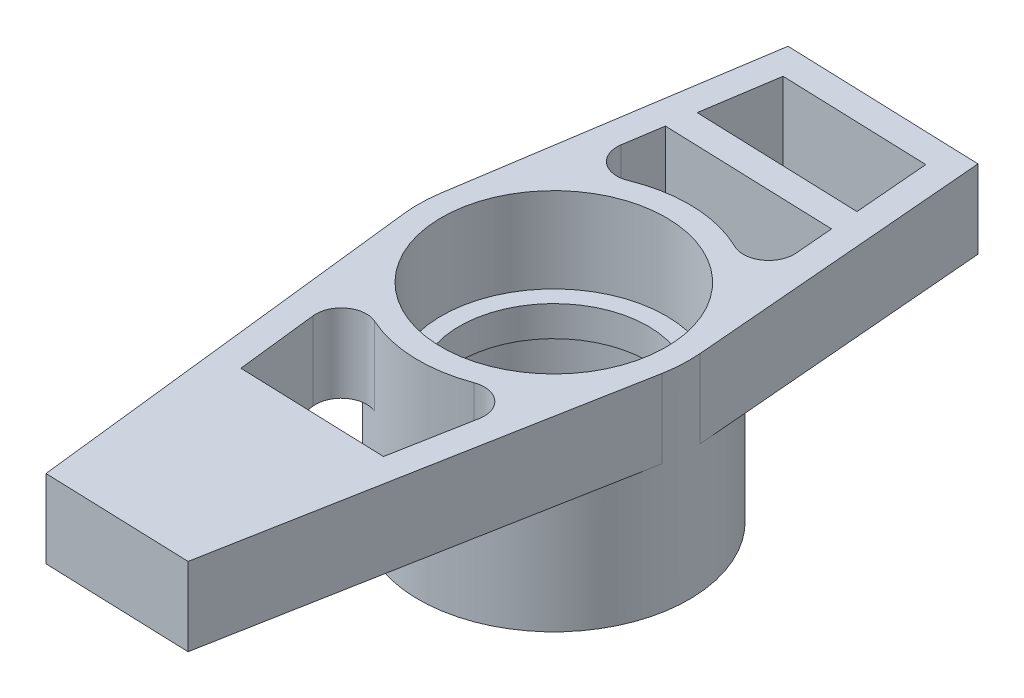
ISO-10303-21;
HEADER;
FILE_DESCRIPTION(('STEP AP214'),'2;1');
FILE_NAME('part.step','',(''),(''),'','','');
FILE_SCHEMA(('AUTOMOTIVE_DESIGN { 1 0 10303 214 1 1 1 1 }'));
ENDSEC;
DATA;
#1=APPLICATION_CONTEXT('core data for automotive mechanical design processes');
#2=APPLICATION_PROTOCOL_DEFINITION('international standard','automotive_design',2000,#1);
#3=PRODUCT_CONTEXT('',#1,'mechanical');
#4=PRODUCT('Part','Part','',(#3));
#5=PRODUCT_RELATED_PRODUCT_CATEGORY('part','',(#4));
#6=PRODUCT_DEFINITION_FORMATION('','',#4);
#7=PRODUCT_DEFINITION_CONTEXT('part definition',#1,'design');
#8=PRODUCT_DEFINITION('design','',#6,#7);
#9=PRODUCT_DEFINITION_SHAPE('','',#8);
#10=(LENGTH_UNIT() NAMED_UNIT(*) SI_UNIT(.MILLI.,.METRE.));
#11=(NAMED_UNIT(*) PLANE_ANGLE_UNIT() SI_UNIT($,.RADIAN.));
#12=(NAMED_UNIT(*) SI_UNIT($,.STERADIAN.) SOLID_ANGLE_UNIT());
#13=UNCERTAINTY_MEASURE_WITH_UNIT(LENGTH_MEASURE(1.E-05),#10,'distance_accuracy_value','');
#14=(GEOMETRIC_REPRESENTATION_CONTEXT(3) GLOBAL_UNCERTAINTY_ASSIGNED_CONTEXT((#13)) GLOBAL_UNIT_ASSIGNED_CONTEXT((#10,
#11,#12)) REPRESENTATION_CONTEXT('',''));
#15=CARTESIAN_POINT('',(0.,0.,0.));
#16=DIRECTION('',(0.,0.,1.));
#17=DIRECTION('',(1.,0.,0.));
#18=AXIS2_PLACEMENT_3D('',#15,#16,#17);
#19=CARTESIAN_POINT('',(0.,-67.691,0.));
#20=DIRECTION('',(0.,1.,0.));
#21=DIRECTION('',(0.,0.,1.));
#22=AXIS2_PLACEMENT_3D('',#19,#20,#21);
#23=CYLINDRICAL_SURFACE('',#22,37.34054);
#24=CARTESIAN_POINT('',(0.,-67.691,0.));
#25=DIRECTION('',(0.,-1.,0.));
#26=DIRECTION('',(0.,0.,-1.));
#27=AXIS2_PLACEMENT_3D('',#24,#25,#26);
#28=CIRCLE('',#27,37.34054);
#29=CARTESIAN_POINT('',(0.,-67.691,-37.34054));
#30=VERTEX_POINT('',#29);
#31=EDGE_CURVE('E12',#30,#30,#28,.T.);
#32=ORIENTED_EDGE('',*,*,#31,.F.);
#33=EDGE_LOOP('',(#32));
#34=FACE_BOUND('',#33,.T.);
#35=DIRECTION('',(0.,1.,0.));
#36=VECTOR('',#35,1.);
#37=CARTESIAN_POINT('',(36.7141403566369,-32.131,6.81086083874628));
#38=LINE('',#37,#36);
#39=CARTESIAN_POINT('',(36.7141403566369,-32.131,6.81086083874629));
#40=VERTEX_POINT('',#39);
#41=CARTESIAN_POINT('',(36.7141403566369,-10.541,6.81086083874628));
#42=VERTEX_POINT('',#41);
#43=EDGE_CURVE('E70',#40,#42,#38,.T.);
#44=ORIENTED_EDGE('',*,*,#43,.F.);
#45=CARTESIAN_POINT('',(0.,-32.131,0.));
#46=DIRECTION('',(0.,-1.,0.));
#47=DIRECTION('',(0.,0.,-1.));
#48=AXIS2_PLACEMENT_3D('',#45,#46,#47);
#49=CIRCLE('',#48,37.34054);
#50=CARTESIAN_POINT('',(12.9848032393378,-32.131,35.0101529892013));
#51=VERTEX_POINT('',#50);
#52=EDGE_CURVE('E65',#40,#51,#49,.T.);
#53=ORIENTED_EDGE('',*,*,#52,.T.);
#54=DIRECTION('',(0.,1.,0.));
#55=VECTOR('',#54,1.);
#56=CARTESIAN_POINT('',(12.9848032393378,-32.131,35.0101529892013));
#57=LINE('',#56,#55);
#58=CARTESIAN_POINT('',(12.9848032393378,-10.541,35.0101529892013));
#59=VERTEX_POINT('',#58);
#60=EDGE_CURVE('E271',#51,#59,#57,.T.);
#61=ORIENTED_EDGE('',*,*,#60,.T.);
#62=CARTESIAN_POINT('',(0.,-10.541,0.));
#63=DIRECTION('',(0.,-1.,0.));
#64=DIRECTION('',(0.,0.,-1.));
#65=AXIS2_PLACEMENT_3D('',#62,#63,#64);
#66=CIRCLE('',#65,37.34054);
#67=CARTESIAN_POINT('',(-15.3953577290297,-10.541,34.0190959298863));
#68=VERTEX_POINT('',#67);
#69=EDGE_CURVE('E752',#59,#68,#66,.T.);
#70=ORIENTED_EDGE('',*,*,#69,.T.);
#71=DIRECTION('',(0.,1.,0.));
#72=VECTOR('',#71,1.);
#73=CARTESIAN_POINT('',(-15.3953577290297,-32.131,34.0190959298863));
#74=LINE('',#73,#72);
#75=CARTESIAN_POINT('',(-15.3953577290297,-32.131,34.0190959298863));
#76=VERTEX_POINT('',#75);
#77=EDGE_CURVE('E282',#76,#68,#74,.T.);
#78=ORIENTED_EDGE('',*,*,#77,.F.);
#79=CARTESIAN_POINT('',(0.,-32.131,0.));
#80=DIRECTION('',(0.,-1.,0.));
#81=DIRECTION('',(0.,0.,-1.));
#82=AXIS2_PLACEMENT_3D('',#79,#80,#81);
#83=CIRCLE('',#82,37.34054);
#84=CARTESIAN_POINT('',(-37.0998081912473,-32.131,4.23322095622985));
#85=VERTEX_POINT('',#84);
#86=EDGE_CURVE('E234',#76,#85,#83,.T.);
#87=ORIENTED_EDGE('',*,*,#86,.T.);
#88=DIRECTION('',(0.,1.,0.));
#89=VECTOR('',#88,1.);
#90=CARTESIAN_POINT('',(-37.0998081912473,-32.131,4.23322095622984));
#91=LINE('',#90,#89);
#92=CARTESIAN_POINT('',(-37.0998081912473,-10.541,4.23322095622984));
#93=VERTEX_POINT('',#92);
#94=EDGE_CURVE('E285',#85,#93,#91,.T.);
#95=ORIENTED_EDGE('',*,*,#94,.T.);
#96=CARTESIAN_POINT('',(-36.9041812246731,-10.541,-5.69186574227512));
#97=VERTEX_POINT('',#96);
#98=EDGE_CURVE('E764',#93,#97,#66,.T.);
#99=ORIENTED_EDGE('',*,*,#98,.T.);
#100=DIRECTION('',(0.,1.,0.));
#101=VECTOR('',#100,1.);
#102=CARTESIAN_POINT('',(-36.9041812246731,-32.131,-5.69186574227513));
#103=LINE('',#102,#101);
#104=CARTESIAN_POINT('',(-36.9041812246731,-32.131,-5.69186574227513));
#105=VERTEX_POINT('',#104);
#106=EDGE_CURVE('E366',#105,#97,#103,.T.);
#107=ORIENTED_EDGE('',*,*,#106,.F.);
#108=CARTESIAN_POINT('',(0.,-32.131,0.));
#109=DIRECTION('',(0.,-1.,0.));
#110=DIRECTION('',(0.,0.,-1.));
#111=AXIS2_PLACEMENT_3D('',#108,#109,#110);
#112=CIRCLE('',#111,37.34054);
#113=CARTESIAN_POINT('',(-14.0428642299643,-32.131,-34.5993336888211));
#114=VERTEX_POINT('',#113);
#115=EDGE_CURVE('E320',#105,#114,#112,.T.);
#116=ORIENTED_EDGE('',*,*,#115,.T.);
#117=DIRECTION('',(0.,1.,0.));
#118=VECTOR('',#117,1.);
#119=CARTESIAN_POINT('',(-14.0428642299643,-32.131,-34.5993336888211));
#120=LINE('',#119,#118);
#121=CARTESIAN_POINT('',(-14.0428642299643,-10.541,-34.5993336888211));
#122=VERTEX_POINT('',#121);
#123=EDGE_CURVE('E369',#114,#122,#120,.T.);
#124=ORIENTED_EDGE('',*,*,#123,.T.);
#125=CARTESIAN_POINT('',(16.4221840305204,-10.541,-33.5354707609618));
#126=VERTEX_POINT('',#125);
#127=EDGE_CURVE('E53',#122,#126,#66,.T.);
#128=ORIENTED_EDGE('',*,*,#127,.T.);
#129=DIRECTION('',(0.,1.,0.));
#130=VECTOR('',#129,1.);
#131=CARTESIAN_POINT('',(16.4221840305204,-32.131,-33.5354707609618));
#132=LINE('',#131,#130);
#133=CARTESIAN_POINT('',(16.4221840305204,-32.131,-33.5354707609617));
#134=VERTEX_POINT('',#133);
#135=EDGE_CURVE('E380',#134,#126,#132,.T.);
#136=ORIENTED_EDGE('',*,*,#135,.F.);
#137=CARTESIAN_POINT('',(0.,-32.131,0.));
#138=DIRECTION('',(0.,-1.,0.));
#139=DIRECTION('',(0.,0.,-1.));
#140=AXIS2_PLACEMENT_3D('',#137,#138,#139);
#141=CIRCLE('',#140,37.34054);
#142=CARTESIAN_POINT('',(37.2113289772135,-32.131,-3.10369509475171));
#143=VERTEX_POINT('',#142);
#144=EDGE_CURVE('E303',#134,#143,#141,.T.);
#145=ORIENTED_EDGE('',*,*,#144,.T.);
#146=DIRECTION('',(0.,1.,0.));
#147=VECTOR('',#146,1.);
#148=CARTESIAN_POINT('',(37.2113289772135,-32.131,-3.10369509475171));
#149=LINE('',#148,#147);
#150=CARTESIAN_POINT('',(37.2113289772135,-10.541,-3.10369509475171));
#151=VERTEX_POINT('',#150);
#152=EDGE_CURVE('E383',#143,#151,#149,.T.);
#153=ORIENTED_EDGE('',*,*,#152,.T.);
#154=EDGE_CURVE('E58',#151,#42,#66,.T.);
#155=ORIENTED_EDGE('',*,*,#154,.T.);
#156=EDGE_LOOP('',(#44,#53,#61,#70,#78,#87,#95,#99,#107,#116,#124,#128,#136,#145,#153,#155));
#157=FACE_BOUND('',#156,.T.);
#158=ADVANCED_FACE('F49',(#34,#157),#23,.T.);
#159=CARTESIAN_POINT('',(0.,-67.691,0.));
#160=DIRECTION('',(0.,1.,0.));
#161=DIRECTION('',(0.,0.,1.));
#162=AXIS2_PLACEMENT_3D('',#159,#160,#161);
#163=CYLINDRICAL_SURFACE('',#162,26.03754);
#164=CARTESIAN_POINT('',(0.,-34.036,0.));
#165=DIRECTION('',(0.,-1.,0.));
#166=DIRECTION('',(0.,0.,-1.));
#167=AXIS2_PLACEMENT_3D('',#164,#165,#166);
#168=CIRCLE('',#167,26.03754);
#169=CARTESIAN_POINT('',(0.,-34.036,-26.03754));
#170=VERTEX_POINT('',#169);
#171=EDGE_CURVE('E404',#170,#170,#168,.T.);
#172=ORIENTED_EDGE('',*,*,#171,.F.);
#173=EDGE_LOOP('',(#172));
#174=FACE_BOUND('',#173,.T.);
#175=CARTESIAN_POINT('',(0.,-42.418,0.));
#176=DIRECTION('',(0.,-1.,0.));
#177=DIRECTION('',(0.,0.,-1.));
#178=AXIS2_PLACEMENT_3D('',#175,#176,#177);
#179=CIRCLE('',#178,26.03754);
#180=CARTESIAN_POINT('',(0.,-42.418,-26.03754));
#181=VERTEX_POINT('',#180);
#182=EDGE_CURVE('E386',#181,#181,#179,.T.);
#183=ORIENTED_EDGE('',*,*,#182,.T.);
#184=EDGE_LOOP('',(#183));
#185=FACE_BOUND('',#184,.T.);
#186=ADVANCED_FACE('F51',(#174,#185),#163,.F.);
#187=CARTESIAN_POINT('',(0.,-67.691,0.));
#188=DIRECTION('',(0.,-1.,0.));
#189=DIRECTION('',(0.,0.,-1.));
#190=AXIS2_PLACEMENT_3D('',#187,#188,#189);
#191=PLANE('',#190);
#192=CARTESIAN_POINT('',(0.,-67.691,0.));
#193=DIRECTION('',(0.,-1.,0.));
#194=DIRECTION('',(0.,0.,-1.));
#195=AXIS2_PLACEMENT_3D('',#192,#193,#194);
#196=CIRCLE('',#195,30.99054);
#197=CARTESIAN_POINT('',(0.,-67.691,-30.99054));
#198=VERTEX_POINT('',#197);
#199=EDGE_CURVE('E397',#198,#198,#196,.T.);
#200=ORIENTED_EDGE('',*,*,#199,.F.);
#201=EDGE_LOOP('',(#200));
#202=FACE_BOUND('',#201,.T.);
#203=ORIENTED_EDGE('',*,*,#31,.T.);
#204=EDGE_LOOP('',(#203));
#205=FACE_BOUND('',#204,.T.);
#206=ADVANCED_FACE('F428',(#202,#205),#191,.T.);
#207=CARTESIAN_POINT('',(0.,-10.541,0.));
#208=DIRECTION('',(0.,-1.,0.));
#209=DIRECTION('',(0.,0.,-1.));
#210=AXIS2_PLACEMENT_3D('',#207,#208,#209);
#211=PLANE('',#210);
#212=ORIENTED_EDGE('',*,*,#98,.F.);
#213=DIRECTION('',(0.113367962976161,0.,0.993553071038803));
#214=VECTOR('',#213,1.);
#215=CARTESIAN_POINT('',(-37.0998081912473,-10.541,4.23322095622985));
#216=LINE('',#215,#214);
#217=CARTESIAN_POINT('',(-24.3746710757541,-10.541,115.755900984861));
#218=VERTEX_POINT('',#217);
#219=EDGE_CURVE('E254',#93,#218,#216,.T.);
#220=ORIENTED_EDGE('',*,*,#219,.T.);
#221=DIRECTION('',(0.999390827019096,0.,0.0348994967025018));
#222=VECTOR('',#221,1.);
#223=CARTESIAN_POINT('',(-4.06704947072605,-10.541,116.465058757856));
#224=LINE('',#223,#222);
#225=CARTESIAN_POINT('',(16.240572134302,-10.541,117.174216530851));
#226=VERTEX_POINT('',#225);
#227=EDGE_CURVE('E252',#218,#226,#224,.T.);
#228=ORIENTED_EDGE('',*,*,#227,.T.);
#229=DIRECTION('',(-0.182398563029519,0.,0.983224676360783));
#230=VECTOR('',#229,1.);
#231=CARTESIAN_POINT('',(36.7141403566369,-10.541,6.81086083874629));
#232=LINE('',#231,#230);
#233=EDGE_CURVE('E224',#42,#226,#232,.T.);
#234=ORIENTED_EDGE('',*,*,#233,.F.);
#235=ORIENTED_EDGE('',*,*,#154,.F.);
#236=DIRECTION('',(0.0831186451709512,0.,0.996539658430584));
#237=VECTOR('',#236,1.);
#238=CARTESIAN_POINT('',(37.2113289772135,-10.541,-3.10369509475171));
#239=LINE('',#238,#237);
#240=CARTESIAN_POINT('',(30.2274757344905,-10.541,-86.8356509118666));
#241=VERTEX_POINT('',#240);
#242=EDGE_CURVE('E338',#241,#151,#239,.T.);
#243=ORIENTED_EDGE('',*,*,#242,.F.);
#244=DIRECTION('',(-0.999390827019096,0.,-0.0348994967025017));
#245=VECTOR('',#244,1.);
#246=CARTESIAN_POINT('',(3.06549070727469,-10.541,-87.7841683299404));
#247=LINE('',#246,#245);
#248=CARTESIAN_POINT('',(-24.0964943199411,-10.541,-88.7326857480141));
#249=VERTEX_POINT('',#248);
#250=EDGE_CURVE('E293',#241,#249,#247,.T.);
#251=ORIENTED_EDGE('',*,*,#250,.T.);
#252=DIRECTION('',(0.152431264847137,0.,-0.988314074319041));
#253=VECTOR('',#252,1.);
#254=CARTESIAN_POINT('',(-36.9041812246731,-10.541,-5.69186574227512));
#255=LINE('',#254,#253);
#256=EDGE_CURVE('E356',#97,#249,#255,.T.);
#257=ORIENTED_EDGE('',*,*,#256,.F.);
#258=EDGE_LOOP('',(#212,#220,#228,#234,#235,#243,#251,#257));
#259=FACE_BOUND('',#258,.T.);
#260=CARTESIAN_POINT('',(-18.2752457471803,-10.541,40.3827796117574));
#261=DIRECTION('',(0.,-1.,0.));
#262=DIRECTION('',(0.,0.,-1.));
#263=AXIS2_PLACEMENT_3D('',#260,#261,#262);
#264=CIRCLE('',#263,6.985);
#265=CARTESIAN_POINT('',(-25.2152139483864,-10.541,41.1746548331459));
#266=VERTEX_POINT('',#265);
#267=EDGE_CURVE('E257',#266,#68,#264,.T.);
#268=ORIENTED_EDGE('',*,*,#267,.T.);
#269=ORIENTED_EDGE('',*,*,#69,.F.);
#270=CARTESIAN_POINT('',(15.4137678613484,-10.541,41.5592258903852));
#271=DIRECTION('',(0.,-1.,0.));
#272=DIRECTION('',(0.,0.,-1.));
#273=AXIS2_PLACEMENT_3D('',#270,#271,#272);
#274=CIRCLE('',#273,6.98499999999999);
#275=CARTESIAN_POINT('',(22.2815922257285,-10.541,42.8332798531464));
#276=VERTEX_POINT('',#275);
#277=EDGE_CURVE('E218',#276,#59,#274,.F.);
#278=ORIENTED_EDGE('',*,*,#277,.F.);
#279=DIRECTION('',(-0.182398563029519,0.,0.983224676360783));
#280=VECTOR('',#279,1.);
#281=CARTESIAN_POINT('',(29.2219683227677,-10.541,5.42098378846133));
#282=LINE('',#281,#280);
#283=CARTESIAN_POINT('',(18.1436576295751,-10.541,65.138934769115));
#284=VERTEX_POINT('',#283);
#285=EDGE_CURVE('E265',#276,#284,#282,.T.);
#286=ORIENTED_EDGE('',*,*,#285,.T.);
#287=DIRECTION('',(0.999390827019096,0.,0.0348994967025018));
#288=VECTOR('',#287,1.);
#289=CARTESIAN_POINT('',(-2.24983267742678,-10.541,64.426778394972));
#290=LINE('',#289,#288);
#291=CARTESIAN_POINT('',(-22.6433229844287,-10.541,63.7146220208289));
#292=VERTEX_POINT('',#291);
#293=EDGE_CURVE('E262',#292,#284,#290,.T.);
#294=ORIENTED_EDGE('',*,*,#293,.F.);
#295=DIRECTION('',(0.113367962976161,0.,0.993553071038803));
#296=VECTOR('',#295,1.);
#297=CARTESIAN_POINT('',(-29.5289337899316,-10.541,3.36935707835151));
#298=LINE('',#297,#296);
#299=EDGE_CURVE('E260',#266,#292,#298,.T.);
#300=ORIENTED_EDGE('',*,*,#299,.F.);
#301=EDGE_LOOP('',(#268,#269,#278,#286,#294,#300));
#302=FACE_BOUND('',#301,.T.);
#303=CARTESIAN_POINT('',(0.,-10.541,0.));
#304=DIRECTION('',(0.,-1.,0.));
#305=DIRECTION('',(0.,0.,-1.));
#306=AXIS2_PLACEMENT_3D('',#303,#304,#305);
#307=CIRCLE('',#306,30.99054);
#308=CARTESIAN_POINT('',(0.,-10.541,-30.99054));
#309=VERTEX_POINT('',#308);
#310=EDGE_CURVE('E401',#309,#309,#307,.T.);
#311=ORIENTED_EDGE('',*,*,#310,.T.);
#312=EDGE_LOOP('',(#311));
#313=FACE_BOUND('',#312,.T.);
#314=CARTESIAN_POINT('',(19.4941523377057,-10.541,-39.8086865008872));
#315=DIRECTION('',(0.,-1.,0.));
#316=DIRECTION('',(0.,0.,-1.));
#317=AXIS2_PLACEMENT_3D('',#314,#315,#316);
#318=CIRCLE('',#317,6.985);
#319=CARTESIAN_POINT('',(26.4549818518434,-10.541,-40.3892702374063));
#320=VERTEX_POINT('',#319);
#321=EDGE_CURVE('E341',#320,#126,#318,.T.);
#322=ORIENTED_EDGE('',*,*,#321,.T.);
#323=ORIENTED_EDGE('',*,*,#127,.F.);
#324=CARTESIAN_POINT('',(-16.6697519676965,-10.541,-41.0715578670578));
#325=DIRECTION('',(0.,-1.,0.));
#326=DIRECTION('',(0.,0.,-1.));
#327=AXIS2_PLACEMENT_3D('',#324,#325,#326);
#328=CIRCLE('',#327,6.98499999999995);
#329=CARTESIAN_POINT('',(-23.5731257768149,-10.541,-42.1362902520151));
#330=VERTEX_POINT('',#329);
#331=EDGE_CURVE('E353',#330,#122,#328,.F.);
#332=ORIENTED_EDGE('',*,*,#331,.F.);
#333=DIRECTION('',(0.152431264847129,0.,-0.988314074319042));
#334=VECTOR('',#333,1.);
#335=CARTESIAN_POINT('',(-29.3732279783616,-10.541,-4.53033950413963));
#336=LINE('',#335,#334);
#337=CARTESIAN_POINT('',(-21.9368761363964,-10.541,-52.7451935524428));
#338=VERTEX_POINT('',#337);
#339=EDGE_CURVE('E350',#330,#338,#336,.T.);
#340=ORIENTED_EDGE('',*,*,#339,.T.);
#341=DIRECTION('',(0.999390827019096,0.,0.0348994967025017));
#342=VECTOR('',#341,1.);
#343=CARTESIAN_POINT('',(1.81294079072256,-10.541,-51.9158316700596));
#344=LINE('',#343,#342);
#345=CARTESIAN_POINT('',(25.5627577178415,-10.541,-51.0864697876765));
#346=VERTEX_POINT('',#345);
#347=EDGE_CURVE('E347',#338,#346,#344,.T.);
#348=ORIENTED_EDGE('',*,*,#347,.T.);
#349=DIRECTION('',(0.0831186451709451,0.,0.996539658430585));
#350=VECTOR('',#349,1.);
#351=CARTESIAN_POINT('',(29.6176967799722,-10.541,-2.47033101854886));
#352=LINE('',#351,#350);
#353=EDGE_CURVE('E344',#346,#320,#352,.T.);
#354=ORIENTED_EDGE('',*,*,#353,.T.);
#355=EDGE_LOOP('',(#322,#323,#332,#340,#348,#354));
#356=FACE_BOUND('',#355,.T.);
#357=DIRECTION('',(0.999390827019096,0.,0.0348994967025019));
#358=VECTOR('',#357,1.);
#359=CARTESIAN_POINT('',(2.07887495559564,-10.541,-59.5311897719451));
#360=LINE('',#359,#358);
#361=CARTESIAN_POINT('',(-20.7671993500609,-10.541,-60.3289922665643));
#362=VERTEX_POINT('',#361);
#363=CARTESIAN_POINT('',(24.9249492612522,-10.541,-58.7333872773259));
#364=VERTEX_POINT('',#363);
#365=EDGE_CURVE('E228',#362,#364,#360,.T.);
#366=ORIENTED_EDGE('',*,*,#365,.F.);
#367=DIRECTION('',(0.152431264847139,0.,-0.98831407431904));
#368=VECTOR('',#367,1.);
#369=CARTESIAN_POINT('',(-29.3732279783621,-10.541,-4.53033950414));
#370=LINE('',#369,#368);
#371=CARTESIAN_POINT('',(-17.5973752590917,-10.541,-80.8810867818338));
#372=VERTEX_POINT('',#371);
#373=EDGE_CURVE('E335',#362,#372,#370,.T.);
#374=ORIENTED_EDGE('',*,*,#373,.T.);
#375=DIRECTION('',(-0.999390827019096,0.,-0.0348994967025017));
#376=VECTOR('',#375,1.);
#377=CARTESIAN_POINT('',(2.79955654240163,-10.541,-80.1688102280549));
#378=LINE('',#377,#376);
#379=CARTESIAN_POINT('',(23.1964883438949,-10.541,-79.456533674276));
#380=VERTEX_POINT('',#379);
#381=EDGE_CURVE('E332',#380,#372,#378,.T.);
#382=ORIENTED_EDGE('',*,*,#381,.F.);
#383=DIRECTION('',(-0.0831186451709525,0.,-0.996539658430584));
#384=VECTOR('',#383,1.);
#385=CARTESIAN_POINT('',(29.6176967799726,-10.541,-2.4703310185491));
#386=LINE('',#385,#384);
#387=EDGE_CURVE('E330',#364,#380,#386,.T.);
#388=ORIENTED_EDGE('',*,*,#387,.F.);
#389=EDGE_LOOP('',(#366,#374,#382,#388));
#390=FACE_BOUND('',#389,.T.);
#391=ADVANCED_FACE('F413',(#259,#302,#313,#356,#390),#211,.F.);
#392=CARTESIAN_POINT('',(0.,-34.036,0.));
#393=DIRECTION('',(0.,1.,0.));
#394=DIRECTION('',(0.,0.,1.));
#395=AXIS2_PLACEMENT_3D('',#392,#393,#394);
#396=CYLINDRICAL_SURFACE('',#395,30.99054);
#397=CARTESIAN_POINT('',(0.,-34.036,0.));
#398=DIRECTION('',(0.,-1.,0.));
#399=DIRECTION('',(0.,0.,-1.));
#400=AXIS2_PLACEMENT_3D('',#397,#398,#399);
#401=CIRCLE('',#400,30.99054);
#402=CARTESIAN_POINT('',(0.,-34.036,-30.99054));
#403=VERTEX_POINT('',#402);
#404=EDGE_CURVE('E407',#403,#403,#401,.T.);
#405=ORIENTED_EDGE('',*,*,#404,.T.);
#406=EDGE_LOOP('',(#405));
#407=FACE_BOUND('',#406,.T.);
#408=ORIENTED_EDGE('',*,*,#310,.F.);
#409=EDGE_LOOP('',(#408));
#410=FACE_BOUND('',#409,.T.);
#411=ADVANCED_FACE('F416',(#407,#410),#396,.F.);
#412=CARTESIAN_POINT('',(0.,-34.036,0.));
#413=DIRECTION('',(0.,-1.,0.));
#414=DIRECTION('',(0.,0.,-1.));
#415=AXIS2_PLACEMENT_3D('',#412,#413,#414);
#416=PLANE('',#415);
#417=ORIENTED_EDGE('',*,*,#171,.T.);
#418=EDGE_LOOP('',(#417));
#419=FACE_BOUND('',#418,.T.);
#420=ORIENTED_EDGE('',*,*,#404,.F.);
#421=EDGE_LOOP('',(#420));
#422=FACE_BOUND('',#421,.T.);
#423=ADVANCED_FACE('F418',(#419,#422),#416,.F.);
#424=CARTESIAN_POINT('',(0.,-42.418,0.));
#425=DIRECTION('',(0.,-1.,0.));
#426=DIRECTION('',(0.,0.,-1.));
#427=AXIS2_PLACEMENT_3D('',#424,#425,#426);
#428=CYLINDRICAL_SURFACE('',#427,30.99054);
#429=CARTESIAN_POINT('',(0.,-42.418,0.));
#430=DIRECTION('',(0.,-1.,0.));
#431=DIRECTION('',(0.,0.,-1.));
#432=AXIS2_PLACEMENT_3D('',#429,#430,#431);
#433=CIRCLE('',#432,30.99054);
#434=CARTESIAN_POINT('',(0.,-42.418,-30.99054));
#435=VERTEX_POINT('',#434);
#436=EDGE_CURVE('E398',#435,#435,#433,.T.);
#437=ORIENTED_EDGE('',*,*,#436,.F.);
#438=EDGE_LOOP('',(#437));
#439=FACE_BOUND('',#438,.T.);
#440=ORIENTED_EDGE('',*,*,#199,.T.);
#441=EDGE_LOOP('',(#440));
#442=FACE_BOUND('',#441,.T.);
#443=ADVANCED_FACE('F424',(#439,#442),#428,.F.);
#444=CARTESIAN_POINT('',(0.,-42.418,0.));
#445=DIRECTION('',(0.,-1.,0.));
#446=DIRECTION('',(0.,0.,-1.));
#447=AXIS2_PLACEMENT_3D('',#444,#445,#446);
#448=PLANE('',#447);
#449=ORIENTED_EDGE('',*,*,#182,.F.);
#450=EDGE_LOOP('',(#449));
#451=FACE_BOUND('',#450,.T.);
#452=ORIENTED_EDGE('',*,*,#436,.T.);
#453=EDGE_LOOP('',(#452));
#454=FACE_BOUND('',#453,.T.);
#455=ADVANCED_FACE('F448',(#451,#454),#448,.T.);
#456=CARTESIAN_POINT('',(37.2113289772135,-32.131,-3.10369509475171));
#457=DIRECTION('',(-0.996539658430584,0.,0.0831186451709512));
#458=DIRECTION('',(0.0831186451709512,0.,0.996539658430584));
#459=AXIS2_PLACEMENT_3D('',#456,#457,#458);
#460=PLANE('',#459);
#461=ORIENTED_EDGE('',*,*,#242,.T.);
#462=ORIENTED_EDGE('',*,*,#152,.F.);
#463=DIRECTION('',(0.0831186451709512,0.,0.996539658430584));
#464=VECTOR('',#463,1.);
#465=CARTESIAN_POINT('',(37.2113289772135,-32.131,-3.10369509475171));
#466=LINE('',#465,#464);
#467=CARTESIAN_POINT('',(30.2274757344905,-32.131,-86.8356509118666));
#468=VERTEX_POINT('',#467);
#469=EDGE_CURVE('E300',#468,#143,#466,.T.);
#470=ORIENTED_EDGE('',*,*,#469,.F.);
#471=DIRECTION('',(0.,1.,0.));
#472=VECTOR('',#471,1.);
#473=CARTESIAN_POINT('',(30.2274757344905,-32.131,-86.8356509118666));
#474=LINE('',#473,#472);
#475=EDGE_CURVE('E361',#468,#241,#474,.T.);
#476=ORIENTED_EDGE('',*,*,#475,.T.);
#477=EDGE_LOOP('',(#461,#462,#470,#476));
#478=FACE_BOUND('',#477,.T.);
#479=ADVANCED_FACE('F454',(#478),#460,.F.);
#480=CARTESIAN_POINT('',(19.4941523377057,-32.131,-39.8086865008872));
#481=DIRECTION('',(0.,1.,0.));
#482=DIRECTION('',(0.,0.,1.));
#483=AXIS2_PLACEMENT_3D('',#480,#481,#482);
#484=CYLINDRICAL_SURFACE('',#483,6.985);
#485=ORIENTED_EDGE('',*,*,#321,.F.);
#486=DIRECTION('',(0.,1.,0.));
#487=VECTOR('',#486,1.);
#488=CARTESIAN_POINT('',(26.4549818518434,-32.131,-40.3892702374063));
#489=LINE('',#488,#487);
#490=CARTESIAN_POINT('',(26.4549818518434,-32.131,-40.3892702374063));
#491=VERTEX_POINT('',#490);
#492=EDGE_CURVE('E378',#491,#320,#489,.T.);
#493=ORIENTED_EDGE('',*,*,#492,.F.);
#494=CARTESIAN_POINT('',(19.4941523377057,-32.131,-39.8086865008872));
#495=DIRECTION('',(0.,-1.,0.));
#496=DIRECTION('',(0.,0.,-1.));
#497=AXIS2_PLACEMENT_3D('',#494,#495,#496);
#498=CIRCLE('',#497,6.985);
#499=EDGE_CURVE('E305',#491,#134,#498,.T.);
#500=ORIENTED_EDGE('',*,*,#499,.T.);
#501=ORIENTED_EDGE('',*,*,#135,.T.);
#502=EDGE_LOOP('',(#485,#493,#500,#501));
#503=FACE_BOUND('',#502,.T.);
#504=ADVANCED_FACE('F479',(#503),#484,.F.);
#505=CARTESIAN_POINT('',(29.6176967799722,-32.131,-2.47033101854886));
#506=DIRECTION('',(-0.996539658430585,0.,0.0831186451709451));
#507=DIRECTION('',(0.0831186451709451,0.,0.996539658430585));
#508=AXIS2_PLACEMENT_3D('',#505,#506,#507);
#509=PLANE('',#508);
#510=ORIENTED_EDGE('',*,*,#353,.F.);
#511=DIRECTION('',(0.,1.,0.));
#512=VECTOR('',#511,1.);
#513=CARTESIAN_POINT('',(25.5627577178415,-32.131,-51.0864697876765));
#514=LINE('',#513,#512);
#515=CARTESIAN_POINT('',(25.5627577178415,-32.131,-51.0864697876765));
#516=VERTEX_POINT('',#515);
#517=EDGE_CURVE('E376',#516,#346,#514,.T.);
#518=ORIENTED_EDGE('',*,*,#517,.F.);
#519=DIRECTION('',(0.0831186451709451,0.,0.996539658430585));
#520=VECTOR('',#519,1.);
#521=CARTESIAN_POINT('',(29.6176967799722,-32.131,-2.47033101854886));
#522=LINE('',#521,#520);
#523=EDGE_CURVE('E308',#516,#491,#522,.T.);
#524=ORIENTED_EDGE('',*,*,#523,.T.);
#525=ORIENTED_EDGE('',*,*,#492,.T.);
#526=EDGE_LOOP('',(#510,#518,#524,#525));
#527=FACE_BOUND('',#526,.T.);
#528=ADVANCED_FACE('F483',(#527),#509,.T.);
#529=CARTESIAN_POINT('',(1.81294079072256,-32.131,-51.9158316700596));
#530=DIRECTION('',(-0.0348994967025017,0.,0.999390827019096));
#531=DIRECTION('',(0.999390827019096,0.,0.0348994967025017));
#532=AXIS2_PLACEMENT_3D('',#529,#530,#531);
#533=PLANE('',#532);
#534=ORIENTED_EDGE('',*,*,#347,.F.);
#535=DIRECTION('',(0.,1.,0.));
#536=VECTOR('',#535,1.);
#537=CARTESIAN_POINT('',(-21.9368761363964,-32.131,-52.7451935524428));
#538=LINE('',#537,#536);
#539=CARTESIAN_POINT('',(-21.9368761363964,-32.131,-52.7451935524428));
#540=VERTEX_POINT('',#539);
#541=EDGE_CURVE('E374',#540,#338,#538,.T.);
#542=ORIENTED_EDGE('',*,*,#541,.F.);
#543=DIRECTION('',(0.999390827019096,0.,0.0348994967025017));
#544=VECTOR('',#543,1.);
#545=CARTESIAN_POINT('',(1.81294079072256,-32.131,-51.9158316700596));
#546=LINE('',#545,#544);
#547=EDGE_CURVE('E311',#540,#516,#546,.T.);
#548=ORIENTED_EDGE('',*,*,#547,.T.);
#549=ORIENTED_EDGE('',*,*,#517,.T.);
#550=EDGE_LOOP('',(#534,#542,#548,#549));
#551=FACE_BOUND('',#550,.T.);
#552=ADVANCED_FACE('F487',(#551),#533,.T.);
#553=CARTESIAN_POINT('',(-29.3732279783616,-32.131,-4.53033950413963));
#554=DIRECTION('',(0.988314074319042,0.,0.152431264847129));
#555=DIRECTION('',(0.152431264847129,0.,-0.988314074319042));
#556=AXIS2_PLACEMENT_3D('',#553,#554,#555);
#557=PLANE('',#556);
#558=ORIENTED_EDGE('',*,*,#339,.F.);
#559=DIRECTION('',(0.,1.,0.));
#560=VECTOR('',#559,1.);
#561=CARTESIAN_POINT('',(-23.5731257768149,-32.131,-42.1362902520151));
#562=LINE('',#561,#560);
#563=CARTESIAN_POINT('',(-23.5731257768149,-32.131,-42.1362902520151));
#564=VERTEX_POINT('',#563);
#565=EDGE_CURVE('E372',#564,#330,#562,.T.);
#566=ORIENTED_EDGE('',*,*,#565,.F.);
#567=DIRECTION('',(0.152431264847129,0.,-0.988314074319042));
#568=VECTOR('',#567,1.);
#569=CARTESIAN_POINT('',(-29.3732279783616,-32.131,-4.53033950413963));
#570=LINE('',#569,#568);
#571=EDGE_CURVE('E314',#564,#540,#570,.T.);
#572=ORIENTED_EDGE('',*,*,#571,.T.);
#573=ORIENTED_EDGE('',*,*,#541,.T.);
#574=EDGE_LOOP('',(#558,#566,#572,#573));
#575=FACE_BOUND('',#574,.T.);
#576=ADVANCED_FACE('F491',(#575),#557,.T.);
#577=CARTESIAN_POINT('',(-16.6697519676965,-32.131,-41.0715578670578));
#578=DIRECTION('',(0.,1.,0.));
#579=DIRECTION('',(0.,0.,1.));
#580=AXIS2_PLACEMENT_3D('',#577,#578,#579);
#581=CYLINDRICAL_SURFACE('',#580,6.98499999999995);
#582=ORIENTED_EDGE('',*,*,#331,.T.);
#583=ORIENTED_EDGE('',*,*,#123,.F.);
#584=CARTESIAN_POINT('',(-16.6697519676965,-32.131,-41.0715578670578));
#585=DIRECTION('',(0.,-1.,0.));
#586=DIRECTION('',(0.,0.,-1.));
#587=AXIS2_PLACEMENT_3D('',#584,#585,#586);
#588=CIRCLE('',#587,6.98499999999995);
#589=EDGE_CURVE('E317',#564,#114,#588,.F.);
#590=ORIENTED_EDGE('',*,*,#589,.F.);
#591=ORIENTED_EDGE('',*,*,#565,.T.);
#592=EDGE_LOOP('',(#582,#583,#590,#591));
#593=FACE_BOUND('',#592,.T.);
#594=ADVANCED_FACE('F495',(#593),#581,.F.);
#595=CARTESIAN_POINT('',(-36.9041812246731,-32.131,-5.69186574227512));
#596=DIRECTION('',(0.988314074319041,0.,0.152431264847137));
#597=DIRECTION('',(0.152431264847137,0.,-0.988314074319041));
#598=AXIS2_PLACEMENT_3D('',#595,#596,#597);
#599=PLANE('',#598);
#600=ORIENTED_EDGE('',*,*,#256,.T.);
#601=DIRECTION('',(0.,1.,0.));
#602=VECTOR('',#601,1.);
#603=CARTESIAN_POINT('',(-24.0964943199411,-32.131,-88.7326857480141));
#604=LINE('',#603,#602);
#605=CARTESIAN_POINT('',(-24.0964943199411,-32.131,-88.7326857480141));
#606=VERTEX_POINT('',#605);
#607=EDGE_CURVE('E363',#606,#249,#604,.T.);
#608=ORIENTED_EDGE('',*,*,#607,.F.);
#609=DIRECTION('',(0.152431264847137,0.,-0.988314074319041));
#610=VECTOR('',#609,1.);
#611=CARTESIAN_POINT('',(-36.9041812246731,-32.131,-5.69186574227512));
#612=LINE('',#611,#610);
#613=EDGE_CURVE('E322',#105,#606,#612,.T.);
#614=ORIENTED_EDGE('',*,*,#613,.F.);
#615=ORIENTED_EDGE('',*,*,#106,.T.);
#616=EDGE_LOOP('',(#600,#608,#614,#615));
#617=FACE_BOUND('',#616,.T.);
#618=ADVANCED_FACE('F463',(#617),#599,.F.);
#619=CARTESIAN_POINT('',(2.07887495559564,-32.131,-59.5311897719451));
#620=DIRECTION('',(-0.0348994967025019,0.,0.999390827019096));
#621=DIRECTION('',(0.999390827019096,0.,0.0348994967025019));
#622=AXIS2_PLACEMENT_3D('',#619,#620,#621);
#623=PLANE('',#622);
#624=ORIENTED_EDGE('',*,*,#365,.T.);
#625=DIRECTION('',(0.,1.,0.));
#626=VECTOR('',#625,1.);
#627=CARTESIAN_POINT('',(24.9249492612522,-32.131,-58.7333872773259));
#628=LINE('',#627,#626);
#629=CARTESIAN_POINT('',(24.9249492612522,-32.131,-58.7333872773259));
#630=VERTEX_POINT('',#629);
#631=EDGE_CURVE('E364',#630,#364,#628,.T.);
#632=ORIENTED_EDGE('',*,*,#631,.F.);
#633=DIRECTION('',(0.999390827019096,0.,0.0348994967025019));
#634=VECTOR('',#633,1.);
#635=CARTESIAN_POINT('',(2.07887495559564,-32.131,-59.5311897719451));
#636=LINE('',#635,#634);
#637=CARTESIAN_POINT('',(-20.7671993500609,-32.131,-60.3289922665643));
#638=VERTEX_POINT('',#637);
#639=EDGE_CURVE('E289',#638,#630,#636,.T.);
#640=ORIENTED_EDGE('',*,*,#639,.F.);
#641=DIRECTION('',(0.,1.,0.));
#642=VECTOR('',#641,1.);
#643=CARTESIAN_POINT('',(-20.7671993500609,-32.131,-60.3289922665643));
#644=LINE('',#643,#642);
#645=EDGE_CURVE('E327',#638,#362,#644,.T.);
#646=ORIENTED_EDGE('',*,*,#645,.T.);
#647=EDGE_LOOP('',(#624,#632,#640,#646));
#648=FACE_BOUND('',#647,.T.);
#649=ADVANCED_FACE('F459',(#648),#623,.F.);
#650=CARTESIAN_POINT('',(29.6176967799726,-32.131,-2.4703310185491));
#651=DIRECTION('',(0.996539658430584,0.,-0.0831186451709525));
#652=DIRECTION('',(-0.0831186451709525,0.,-0.996539658430584));
#653=AXIS2_PLACEMENT_3D('',#650,#651,#652);
#654=PLANE('',#653);
#655=ORIENTED_EDGE('',*,*,#387,.T.);
#656=DIRECTION('',(0.,1.,0.));
#657=VECTOR('',#656,1.);
#658=CARTESIAN_POINT('',(23.1964883438949,-32.131,-79.456533674276));
#659=LINE('',#658,#657);
#660=CARTESIAN_POINT('',(23.1964883438949,-32.131,-79.456533674276));
#661=VERTEX_POINT('',#660);
#662=EDGE_CURVE('E390',#661,#380,#659,.T.);
#663=ORIENTED_EDGE('',*,*,#662,.F.);
#664=DIRECTION('',(-0.0831186451709525,0.,-0.996539658430584));
#665=VECTOR('',#664,1.);
#666=CARTESIAN_POINT('',(29.6176967799726,-32.131,-2.4703310185491));
#667=LINE('',#666,#665);
#668=EDGE_CURVE('E292',#630,#661,#667,.T.);
#669=ORIENTED_EDGE('',*,*,#668,.F.);
#670=ORIENTED_EDGE('',*,*,#631,.T.);
#671=EDGE_LOOP('',(#655,#663,#669,#670));
#672=FACE_BOUND('',#671,.T.);
#673=ADVANCED_FACE('F462',(#672),#654,.F.);
#674=CARTESIAN_POINT('',(2.79955654240163,-32.131,-80.1688102280549));
#675=DIRECTION('',(0.0348994967025017,0.,-0.999390827019096));
#676=DIRECTION('',(-0.999390827019096,0.,-0.0348994967025017));
#677=AXIS2_PLACEMENT_3D('',#674,#675,#676);
#678=PLANE('',#677);
#679=ORIENTED_EDGE('',*,*,#381,.T.);
#680=DIRECTION('',(0.,1.,0.));
#681=VECTOR('',#680,1.);
#682=CARTESIAN_POINT('',(-17.5973752590917,-32.131,-80.8810867818338));
#683=LINE('',#682,#681);
#684=CARTESIAN_POINT('',(-17.5973752590917,-32.131,-80.8810867818338));
#685=VERTEX_POINT('',#684);
#686=EDGE_CURVE('E388',#685,#372,#683,.T.);
#687=ORIENTED_EDGE('',*,*,#686,.F.);
#688=DIRECTION('',(-0.999390827019096,0.,-0.0348994967025017));
#689=VECTOR('',#688,1.);
#690=CARTESIAN_POINT('',(2.79955654240163,-32.131,-80.1688102280549));
#691=LINE('',#690,#689);
#692=EDGE_CURVE('E295',#661,#685,#691,.T.);
#693=ORIENTED_EDGE('',*,*,#692,.F.);
#694=ORIENTED_EDGE('',*,*,#662,.T.);
#695=EDGE_LOOP('',(#679,#687,#693,#694));
#696=FACE_BOUND('',#695,.T.);
#697=ADVANCED_FACE('F467',(#696),#678,.F.);
#698=CARTESIAN_POINT('',(-29.3732279783621,-32.131,-4.53033950414));
#699=DIRECTION('',(0.98831407431904,0.,0.152431264847139));
#700=DIRECTION('',(0.152431264847139,0.,-0.98831407431904));
#701=AXIS2_PLACEMENT_3D('',#698,#699,#700);
#702=PLANE('',#701);
#703=ORIENTED_EDGE('',*,*,#373,.F.);
#704=ORIENTED_EDGE('',*,*,#645,.F.);
#705=DIRECTION('',(0.152431264847139,0.,-0.98831407431904));
#706=VECTOR('',#705,1.);
#707=CARTESIAN_POINT('',(-29.3732279783621,-32.131,-4.53033950414));
#708=LINE('',#707,#706);
#709=EDGE_CURVE('E297',#638,#685,#708,.T.);
#710=ORIENTED_EDGE('',*,*,#709,.T.);
#711=ORIENTED_EDGE('',*,*,#686,.T.);
#712=EDGE_LOOP('',(#703,#704,#710,#711));
#713=FACE_BOUND('',#712,.T.);
#714=ADVANCED_FACE('F471',(#713),#702,.T.);
#715=CARTESIAN_POINT('',(3.06549070727469,-32.131,-87.7841683299404));
#716=DIRECTION('',(0.0348994967025016,0.,-0.999390827019096));
#717=DIRECTION('',(-0.999390827019096,0.,-0.0348994967025017));
#718=AXIS2_PLACEMENT_3D('',#715,#716,#717);
#719=PLANE('',#718);
#720=ORIENTED_EDGE('',*,*,#250,.F.);
#721=ORIENTED_EDGE('',*,*,#475,.F.);
#722=DIRECTION('',(-0.999390827019096,0.,-0.0348994967025017));
#723=VECTOR('',#722,1.);
#724=CARTESIAN_POINT('',(3.06549070727469,-32.131,-87.7841683299404));
#725=LINE('',#724,#723);
#726=EDGE_CURVE('E324',#468,#606,#725,.T.);
#727=ORIENTED_EDGE('',*,*,#726,.T.);
#728=ORIENTED_EDGE('',*,*,#607,.T.);
#729=EDGE_LOOP('',(#720,#721,#727,#728));
#730=FACE_BOUND('',#729,.T.);
#731=ADVANCED_FACE('F475',(#730),#719,.T.);
#732=CARTESIAN_POINT('',(0.,-32.131,0.));
#733=DIRECTION('',(0.,-1.,0.));
#734=DIRECTION('',(0.,0.,-1.));
#735=AXIS2_PLACEMENT_3D('',#732,#733,#734);
#736=PLANE('',#735);
#737=ORIENTED_EDGE('',*,*,#639,.T.);
#738=ORIENTED_EDGE('',*,*,#668,.T.);
#739=ORIENTED_EDGE('',*,*,#692,.T.);
#740=ORIENTED_EDGE('',*,*,#709,.F.);
#741=EDGE_LOOP('',(#737,#738,#739,#740));
#742=FACE_BOUND('',#741,.T.);
#743=ORIENTED_EDGE('',*,*,#469,.T.);
#744=ORIENTED_EDGE('',*,*,#144,.F.);
#745=ORIENTED_EDGE('',*,*,#499,.F.);
#746=ORIENTED_EDGE('',*,*,#523,.F.);
#747=ORIENTED_EDGE('',*,*,#547,.F.);
#748=ORIENTED_EDGE('',*,*,#571,.F.);
#749=ORIENTED_EDGE('',*,*,#589,.T.);
#750=ORIENTED_EDGE('',*,*,#115,.F.);
#751=ORIENTED_EDGE('',*,*,#613,.T.);
#752=ORIENTED_EDGE('',*,*,#726,.F.);
#753=EDGE_LOOP('',(#743,#744,#745,#746,#747,#748,#749,#750,#751,#752));
#754=FACE_BOUND('',#753,.T.);
#755=ADVANCED_FACE('F505',(#742,#754),#736,.T.);
#756=CARTESIAN_POINT('',(36.7141403566369,-32.131,6.81086083874629));
#757=DIRECTION('',(-0.983224676360783,0.,-0.182398563029519));
#758=DIRECTION('',(-0.182398563029519,0.,0.983224676360783));
#759=AXIS2_PLACEMENT_3D('',#756,#757,#758);
#760=PLANE('',#759);
#761=ORIENTED_EDGE('',*,*,#233,.T.);
#762=DIRECTION('',(0.,1.,0.));
#763=VECTOR('',#762,1.);
#764=CARTESIAN_POINT('',(16.240572134302,-32.131,117.174216530851));
#765=LINE('',#764,#763);
#766=CARTESIAN_POINT('',(16.240572134302,-32.131,117.174216530851));
#767=VERTEX_POINT('',#766);
#768=EDGE_CURVE('E221',#767,#226,#765,.T.);
#769=ORIENTED_EDGE('',*,*,#768,.F.);
#770=DIRECTION('',(-0.182398563029519,0.,0.983224676360783));
#771=VECTOR('',#770,1.);
#772=CARTESIAN_POINT('',(36.7141403566369,-32.131,6.81086083874629));
#773=LINE('',#772,#771);
#774=EDGE_CURVE('E210',#40,#767,#773,.T.);
#775=ORIENTED_EDGE('',*,*,#774,.F.);
#776=ORIENTED_EDGE('',*,*,#43,.T.);
#777=EDGE_LOOP('',(#761,#769,#775,#776));
#778=FACE_BOUND('',#777,.T.);
#779=ADVANCED_FACE('F222',(#778),#760,.F.);
#780=CARTESIAN_POINT('',(-4.06704947072605,-32.131,116.465058757856));
#781=DIRECTION('',(-0.0348994967025018,0.,0.999390827019096));
#782=DIRECTION('',(0.999390827019096,0.,0.0348994967025018));
#783=AXIS2_PLACEMENT_3D('',#780,#781,#782);
#784=PLANE('',#783);
#785=ORIENTED_EDGE('',*,*,#227,.F.);
#786=DIRECTION('',(0.,1.,0.));
#787=VECTOR('',#786,1.);
#788=CARTESIAN_POINT('',(-24.3746710757541,-32.131,115.755900984861));
#789=LINE('',#788,#787);
#790=CARTESIAN_POINT('',(-24.3746710757541,-32.131,115.755900984861));
#791=VERTEX_POINT('',#790);
#792=EDGE_CURVE('E229',#791,#218,#789,.T.);
#793=ORIENTED_EDGE('',*,*,#792,.F.);
#794=DIRECTION('',(0.999390827019096,0.,0.0348994967025018));
#795=VECTOR('',#794,1.);
#796=CARTESIAN_POINT('',(-4.06704947072605,-32.131,116.465058757856));
#797=LINE('',#796,#795);
#798=EDGE_CURVE('E215',#791,#767,#797,.T.);
#799=ORIENTED_EDGE('',*,*,#798,.T.);
#800=ORIENTED_EDGE('',*,*,#768,.T.);
#801=EDGE_LOOP('',(#785,#793,#799,#800));
#802=FACE_BOUND('',#801,.T.);
#803=ADVANCED_FACE('F231',(#802),#784,.T.);
#804=CARTESIAN_POINT('',(-37.0998081912473,-32.131,4.23322095622985));
#805=DIRECTION('',(-0.993553071038803,0.,0.113367962976161));
#806=DIRECTION('',(0.113367962976161,0.,0.993553071038803));
#807=AXIS2_PLACEMENT_3D('',#804,#805,#806);
#808=PLANE('',#807);
#809=ORIENTED_EDGE('',*,*,#219,.F.);
#810=ORIENTED_EDGE('',*,*,#94,.F.);
#811=DIRECTION('',(0.113367962976161,0.,0.993553071038803));
#812=VECTOR('',#811,1.);
#813=CARTESIAN_POINT('',(-37.0998081912473,-32.131,4.23322095622985));
#814=LINE('',#813,#812);
#815=EDGE_CURVE('E232',#85,#791,#814,.T.);
#816=ORIENTED_EDGE('',*,*,#815,.T.);
#817=ORIENTED_EDGE('',*,*,#792,.T.);
#818=EDGE_LOOP('',(#809,#810,#816,#817));
#819=FACE_BOUND('',#818,.T.);
#820=ADVANCED_FACE('F513',(#819),#808,.T.);
#821=CARTESIAN_POINT('',(-18.2752457471803,-32.131,40.3827796117574));
#822=DIRECTION('',(0.,1.,0.));
#823=DIRECTION('',(0.,0.,1.));
#824=AXIS2_PLACEMENT_3D('',#821,#822,#823);
#825=CYLINDRICAL_SURFACE('',#824,6.985);
#826=ORIENTED_EDGE('',*,*,#267,.F.);
#827=DIRECTION('',(0.,1.,0.));
#828=VECTOR('',#827,1.);
#829=CARTESIAN_POINT('',(-25.2152139483864,-32.131,41.1746548331459));
#830=LINE('',#829,#828);
#831=CARTESIAN_POINT('',(-25.2152139483864,-32.131,41.1746548331459));
#832=VERTEX_POINT('',#831);
#833=EDGE_CURVE('E280',#832,#266,#830,.T.);
#834=ORIENTED_EDGE('',*,*,#833,.F.);
#835=CARTESIAN_POINT('',(-18.2752457471803,-32.131,40.3827796117574));
#836=DIRECTION('',(0.,-1.,0.));
#837=DIRECTION('',(0.,0.,-1.));
#838=AXIS2_PLACEMENT_3D('',#835,#836,#837);
#839=CIRCLE('',#838,6.985);
#840=EDGE_CURVE('E238',#832,#76,#839,.T.);
#841=ORIENTED_EDGE('',*,*,#840,.T.);
#842=ORIENTED_EDGE('',*,*,#77,.T.);
#843=EDGE_LOOP('',(#826,#834,#841,#842));
#844=FACE_BOUND('',#843,.T.);
#845=ADVANCED_FACE('F516',(#844),#825,.F.);
#846=CARTESIAN_POINT('',(-29.5289337899316,-32.131,3.36935707835151));
#847=DIRECTION('',(-0.993553071038803,0.,0.113367962976161));
#848=DIRECTION('',(0.113367962976161,0.,0.993553071038803));
#849=AXIS2_PLACEMENT_3D('',#846,#847,#848);
#850=PLANE('',#849);
#851=ORIENTED_EDGE('',*,*,#299,.T.);
#852=DIRECTION('',(0.,1.,0.));
#853=VECTOR('',#852,1.);
#854=CARTESIAN_POINT('',(-22.6433229844287,-32.131,63.7146220208289));
#855=LINE('',#854,#853);
#856=CARTESIAN_POINT('',(-22.6433229844287,-32.131,63.7146220208289));
#857=VERTEX_POINT('',#856);
#858=EDGE_CURVE('E277',#857,#292,#855,.T.);
#859=ORIENTED_EDGE('',*,*,#858,.F.);
#860=DIRECTION('',(0.113367962976161,0.,0.993553071038803));
#861=VECTOR('',#860,1.);
#862=CARTESIAN_POINT('',(-29.5289337899316,-32.131,3.36935707835151));
#863=LINE('',#862,#861);
#864=EDGE_CURVE('E241',#832,#857,#863,.T.);
#865=ORIENTED_EDGE('',*,*,#864,.F.);
#866=ORIENTED_EDGE('',*,*,#833,.T.);
#867=EDGE_LOOP('',(#851,#859,#865,#866));
#868=FACE_BOUND('',#867,.T.);
#869=ADVANCED_FACE('F520',(#868),#850,.F.);
#870=CARTESIAN_POINT('',(-2.24983267742678,-32.131,64.426778394972));
#871=DIRECTION('',(-0.0348994967025018,0.,0.999390827019096));
#872=DIRECTION('',(0.999390827019096,0.,0.0348994967025018));
#873=AXIS2_PLACEMENT_3D('',#870,#871,#872);
#874=PLANE('',#873);
#875=ORIENTED_EDGE('',*,*,#293,.T.);
#876=DIRECTION('',(0.,1.,0.));
#877=VECTOR('',#876,1.);
#878=CARTESIAN_POINT('',(18.1436576295751,-32.131,65.138934769115));
#879=LINE('',#878,#877);
#880=CARTESIAN_POINT('',(18.1436576295751,-32.131,65.138934769115));
#881=VERTEX_POINT('',#880);
#882=EDGE_CURVE('E275',#881,#284,#879,.T.);
#883=ORIENTED_EDGE('',*,*,#882,.F.);
#884=DIRECTION('',(0.999390827019096,0.,0.0348994967025018));
#885=VECTOR('',#884,1.);
#886=CARTESIAN_POINT('',(-2.24983267742678,-32.131,64.426778394972));
#887=LINE('',#886,#885);
#888=EDGE_CURVE('E243',#857,#881,#887,.T.);
#889=ORIENTED_EDGE('',*,*,#888,.F.);
#890=ORIENTED_EDGE('',*,*,#858,.T.);
#891=EDGE_LOOP('',(#875,#883,#889,#890));
#892=FACE_BOUND('',#891,.T.);
#893=ADVANCED_FACE('F524',(#892),#874,.F.);
#894=CARTESIAN_POINT('',(29.2219683227677,-32.131,5.42098378846133));
#895=DIRECTION('',(-0.983224676360783,0.,-0.182398563029519));
#896=DIRECTION('',(-0.182398563029519,0.,0.983224676360783));
#897=AXIS2_PLACEMENT_3D('',#894,#895,#896);
#898=PLANE('',#897);
#899=ORIENTED_EDGE('',*,*,#285,.F.);
#900=DIRECTION('',(0.,1.,0.));
#901=VECTOR('',#900,1.);
#902=CARTESIAN_POINT('',(22.2815922257285,-32.131,42.8332798531464));
#903=LINE('',#902,#901);
#904=CARTESIAN_POINT('',(22.2815922257285,-32.131,42.8332798531464));
#905=VERTEX_POINT('',#904);
#906=EDGE_CURVE('E273',#905,#276,#903,.T.);
#907=ORIENTED_EDGE('',*,*,#906,.F.);
#908=DIRECTION('',(-0.182398563029519,0.,0.983224676360783));
#909=VECTOR('',#908,1.);
#910=CARTESIAN_POINT('',(29.2219683227677,-32.131,5.42098378846133));
#911=LINE('',#910,#909);
#912=EDGE_CURVE('E245',#905,#881,#911,.T.);
#913=ORIENTED_EDGE('',*,*,#912,.T.);
#914=ORIENTED_EDGE('',*,*,#882,.T.);
#915=EDGE_LOOP('',(#899,#907,#913,#914));
#916=FACE_BOUND('',#915,.T.);
#917=ADVANCED_FACE('F528',(#916),#898,.T.);
#918=CARTESIAN_POINT('',(15.4137678613484,-32.131,41.5592258903852));
#919=DIRECTION('',(0.,1.,0.));
#920=DIRECTION('',(0.,0.,1.));
#921=AXIS2_PLACEMENT_3D('',#918,#919,#920);
#922=CYLINDRICAL_SURFACE('',#921,6.98499999999999);
#923=ORIENTED_EDGE('',*,*,#277,.T.);
#924=ORIENTED_EDGE('',*,*,#60,.F.);
#925=CARTESIAN_POINT('',(15.4137678613484,-32.131,41.5592258903852));
#926=DIRECTION('',(0.,-1.,0.));
#927=DIRECTION('',(0.,0.,-1.));
#928=AXIS2_PLACEMENT_3D('',#925,#926,#927);
#929=CIRCLE('',#928,6.98499999999999);
#930=EDGE_CURVE('E248',#905,#51,#929,.F.);
#931=ORIENTED_EDGE('',*,*,#930,.F.);
#932=ORIENTED_EDGE('',*,*,#906,.T.);
#933=EDGE_LOOP('',(#923,#924,#931,#932));
#934=FACE_BOUND('',#933,.T.);
#935=ADVANCED_FACE('F532',(#934),#922,.F.);
#936=CARTESIAN_POINT('',(0.,-32.131,0.));
#937=DIRECTION('',(0.,-1.,0.));
#938=DIRECTION('',(0.,0.,-1.));
#939=AXIS2_PLACEMENT_3D('',#936,#937,#938);
#940=PLANE('',#939);
#941=ORIENTED_EDGE('',*,*,#774,.T.);
#942=ORIENTED_EDGE('',*,*,#798,.F.);
#943=ORIENTED_EDGE('',*,*,#815,.F.);
#944=ORIENTED_EDGE('',*,*,#86,.F.);
#945=ORIENTED_EDGE('',*,*,#840,.F.);
#946=ORIENTED_EDGE('',*,*,#864,.T.);
#947=ORIENTED_EDGE('',*,*,#888,.T.);
#948=ORIENTED_EDGE('',*,*,#912,.F.);
#949=ORIENTED_EDGE('',*,*,#930,.T.);
#950=ORIENTED_EDGE('',*,*,#52,.F.);
#951=EDGE_LOOP('',(#941,#942,#943,#944,#945,#946,#947,#948,#949,#950));
#952=FACE_BOUND('',#951,.T.);
#953=ADVANCED_FACE('F212',(#952),#940,.T.);
#954=CLOSED_SHELL('',(#158,#186,#206,#391,#411,#423,#443,#455,#479,#504,#528,#552,#576,#594,
#618,#649,#673,#697,#714,#731,#755,#779,#803,#820,#845,#869,#893,#917,#935,#953));
#955=MANIFOLD_SOLID_BREP('B2',#954);
#956=ADVANCED_BREP_SHAPE_REPRESENTATION('',(#18,#955),#14);
#957=SHAPE_DEFINITION_REPRESENTATION(#9,#956);
ENDSEC;
END-ISO-10303-21;
